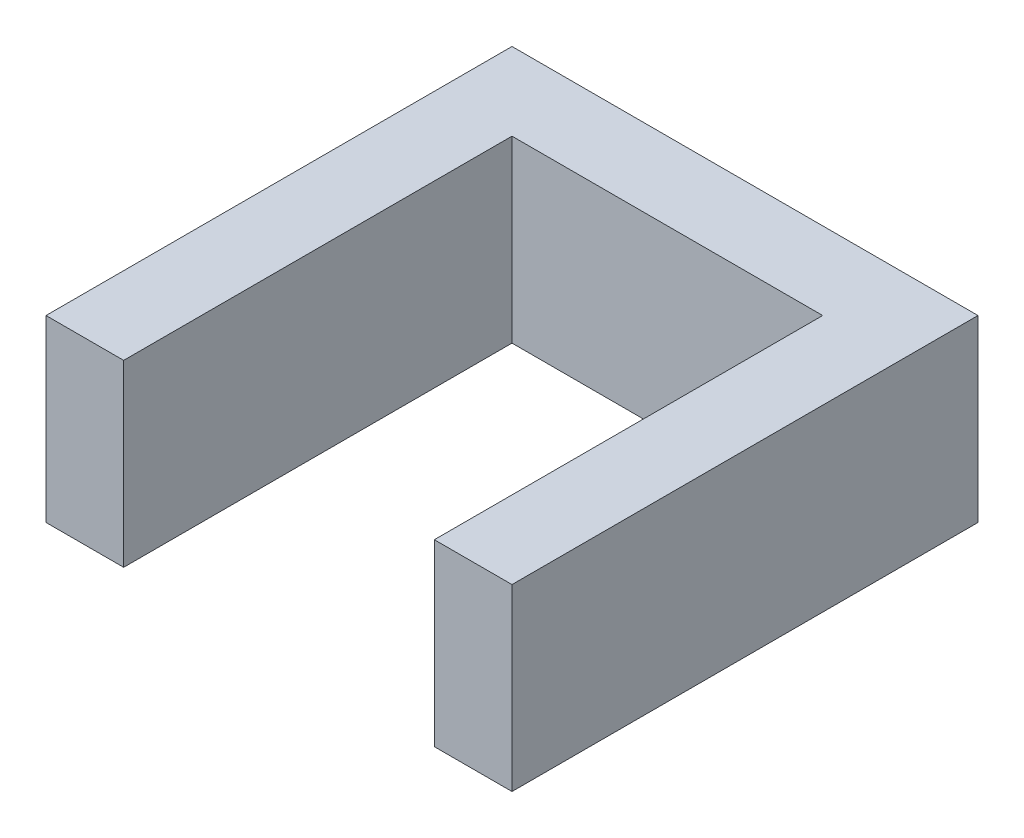
ISO-10303-21;
HEADER;
FILE_DESCRIPTION(('STEP AP214'),'2;1');
FILE_NAME('part.step','',(''),(''),'','','');
FILE_SCHEMA(('AUTOMOTIVE_DESIGN { 1 0 10303 214 1 1 1 1 }'));
ENDSEC;
DATA;
#1=APPLICATION_CONTEXT('core data for automotive mechanical design processes');
#2=APPLICATION_PROTOCOL_DEFINITION('international standard','automotive_design',2000,#1);
#3=PRODUCT_CONTEXT('',#1,'mechanical');
#4=PRODUCT('Part','Part','',(#3));
#5=PRODUCT_RELATED_PRODUCT_CATEGORY('part','',(#4));
#6=PRODUCT_DEFINITION_FORMATION('','',#4);
#7=PRODUCT_DEFINITION_CONTEXT('part definition',#1,'design');
#8=PRODUCT_DEFINITION('design','',#6,#7);
#9=PRODUCT_DEFINITION_SHAPE('','',#8);
#10=(LENGTH_UNIT() NAMED_UNIT(*) SI_UNIT(.MILLI.,.METRE.));
#11=(NAMED_UNIT(*) PLANE_ANGLE_UNIT() SI_UNIT($,.RADIAN.));
#12=(NAMED_UNIT(*) SI_UNIT($,.STERADIAN.) SOLID_ANGLE_UNIT());
#13=UNCERTAINTY_MEASURE_WITH_UNIT(LENGTH_MEASURE(1.E-05),#10,'distance_accuracy_value','');
#14=(GEOMETRIC_REPRESENTATION_CONTEXT(3) GLOBAL_UNCERTAINTY_ASSIGNED_CONTEXT((#13)) GLOBAL_UNIT_ASSIGNED_CONTEXT((#10,
#11,#12)) REPRESENTATION_CONTEXT('',''));
#15=CARTESIAN_POINT('',(0.,0.,0.));
#16=DIRECTION('',(0.,0.,1.));
#17=DIRECTION('',(1.,0.,0.));
#18=AXIS2_PLACEMENT_3D('',#15,#16,#17);
#19=CARTESIAN_POINT('',(5.,11.54,0.));
#20=DIRECTION('',(0.,0.,-1.));
#21=DIRECTION('',(-1.,0.,0.));
#22=AXIS2_PLACEMENT_3D('',#19,#20,#21);
#23=PLANE('',#22);
#24=DIRECTION('',(1.,0.,0.));
#25=VECTOR('',#24,1.);
#26=CARTESIAN_POINT('',(5.,0.,0.));
#27=LINE('',#26,#25);
#28=CARTESIAN_POINT('',(0.,0.,0.));
#29=VERTEX_POINT('',#28);
#30=CARTESIAN_POINT('',(5.,0.,0.));
#31=VERTEX_POINT('',#30);
#32=EDGE_CURVE('E140',#29,#31,#27,.T.);
#33=ORIENTED_EDGE('',*,*,#32,.T.);
#34=DIRECTION('',(0.,-1.,0.));
#35=VECTOR('',#34,1.);
#36=CARTESIAN_POINT('',(5.,11.54,0.));
#37=LINE('',#36,#35);
#38=CARTESIAN_POINT('',(5.,11.54,0.));
#39=VERTEX_POINT('',#38);
#40=EDGE_CURVE('E11',#39,#31,#37,.T.);
#41=ORIENTED_EDGE('',*,*,#40,.F.);
#42=DIRECTION('',(1.,0.,0.));
#43=VECTOR('',#42,1.);
#44=CARTESIAN_POINT('',(5.,11.54,0.));
#45=LINE('',#44,#43);
#46=CARTESIAN_POINT('',(0.,11.54,0.));
#47=VERTEX_POINT('',#46);
#48=EDGE_CURVE('E162',#47,#39,#45,.T.);
#49=ORIENTED_EDGE('',*,*,#48,.F.);
#50=DIRECTION('',(0.,-1.,0.));
#51=VECTOR('',#50,1.);
#52=CARTESIAN_POINT('',(0.,11.54,0.));
#53=LINE('',#52,#51);
#54=EDGE_CURVE('E136',#47,#29,#53,.T.);
#55=ORIENTED_EDGE('',*,*,#54,.T.);
#56=EDGE_LOOP('',(#33,#41,#49,#55));
#57=FACE_BOUND('',#56,.T.);
#58=ADVANCED_FACE('F39',(#57),#23,.F.);
#59=CARTESIAN_POINT('',(5.,11.54,0.));
#60=DIRECTION('',(-1.,0.,0.));
#61=DIRECTION('',(0.,0.,1.));
#62=AXIS2_PLACEMENT_3D('',#59,#60,#61);
#63=PLANE('',#62);
#64=DIRECTION('',(0.,0.,-1.));
#65=VECTOR('',#64,1.);
#66=CARTESIAN_POINT('',(5.,0.,0.));
#67=LINE('',#66,#65);
#68=CARTESIAN_POINT('',(5.,0.,-25.));
#69=VERTEX_POINT('',#68);
#70=EDGE_CURVE('E144',#31,#69,#67,.T.);
#71=ORIENTED_EDGE('',*,*,#70,.T.);
#72=DIRECTION('',(0.,-1.,0.));
#73=VECTOR('',#72,1.);
#74=CARTESIAN_POINT('',(5.,11.54,-25.));
#75=LINE('',#74,#73);
#76=CARTESIAN_POINT('',(5.,11.54,-25.));
#77=VERTEX_POINT('',#76);
#78=EDGE_CURVE('E48',#77,#69,#75,.T.);
#79=ORIENTED_EDGE('',*,*,#78,.F.);
#80=DIRECTION('',(0.,0.,-1.));
#81=VECTOR('',#80,1.);
#82=CARTESIAN_POINT('',(5.,11.54,0.));
#83=LINE('',#82,#81);
#84=EDGE_CURVE('E99',#39,#77,#83,.T.);
#85=ORIENTED_EDGE('',*,*,#84,.F.);
#86=ORIENTED_EDGE('',*,*,#40,.T.);
#87=EDGE_LOOP('',(#71,#79,#85,#86));
#88=FACE_BOUND('',#87,.T.);
#89=ADVANCED_FACE('F208',(#88),#63,.F.);
#90=CARTESIAN_POINT('',(5.,11.54,-25.));
#91=DIRECTION('',(0.,0.,-1.));
#92=DIRECTION('',(-1.,0.,0.));
#93=AXIS2_PLACEMENT_3D('',#90,#91,#92);
#94=PLANE('',#93);
#95=DIRECTION('',(1.,0.,0.));
#96=VECTOR('',#95,1.);
#97=CARTESIAN_POINT('',(5.,0.,-25.));
#98=LINE('',#97,#96);
#99=CARTESIAN_POINT('',(25.,0.,-25.));
#100=VERTEX_POINT('',#99);
#101=EDGE_CURVE('E147',#69,#100,#98,.T.);
#102=ORIENTED_EDGE('',*,*,#101,.T.);
#103=DIRECTION('',(0.,-1.,0.));
#104=VECTOR('',#103,1.);
#105=CARTESIAN_POINT('',(25.,11.54,-25.));
#106=LINE('',#105,#104);
#107=CARTESIAN_POINT('',(25.,11.54,-25.));
#108=VERTEX_POINT('',#107);
#109=EDGE_CURVE('E173',#108,#100,#106,.T.);
#110=ORIENTED_EDGE('',*,*,#109,.F.);
#111=DIRECTION('',(1.,0.,0.));
#112=VECTOR('',#111,1.);
#113=CARTESIAN_POINT('',(5.,11.54,-25.));
#114=LINE('',#113,#112);
#115=EDGE_CURVE('E183',#77,#108,#114,.T.);
#116=ORIENTED_EDGE('',*,*,#115,.F.);
#117=ORIENTED_EDGE('',*,*,#78,.T.);
#118=EDGE_LOOP('',(#102,#110,#116,#117));
#119=FACE_BOUND('',#118,.T.);
#120=ADVANCED_FACE('F181',(#119),#94,.F.);
#121=CARTESIAN_POINT('',(25.,11.54,-25.));
#122=DIRECTION('',(1.,0.,0.));
#123=DIRECTION('',(0.,0.,-1.));
#124=AXIS2_PLACEMENT_3D('',#121,#122,#123);
#125=PLANE('',#124);
#126=DIRECTION('',(0.,0.,1.));
#127=VECTOR('',#126,1.);
#128=CARTESIAN_POINT('',(25.,0.,-25.));
#129=LINE('',#128,#127);
#130=CARTESIAN_POINT('',(25.,0.,0.));
#131=VERTEX_POINT('',#130);
#132=EDGE_CURVE('E150',#100,#131,#129,.T.);
#133=ORIENTED_EDGE('',*,*,#132,.T.);
#134=DIRECTION('',(0.,-1.,0.));
#135=VECTOR('',#134,1.);
#136=CARTESIAN_POINT('',(25.,11.54,0.));
#137=LINE('',#136,#135);
#138=CARTESIAN_POINT('',(25.,11.54,0.));
#139=VERTEX_POINT('',#138);
#140=EDGE_CURVE('E169',#139,#131,#137,.T.);
#141=ORIENTED_EDGE('',*,*,#140,.F.);
#142=DIRECTION('',(0.,0.,1.));
#143=VECTOR('',#142,1.);
#144=CARTESIAN_POINT('',(25.,11.54,-25.));
#145=LINE('',#144,#143);
#146=EDGE_CURVE('E196',#108,#139,#145,.T.);
#147=ORIENTED_EDGE('',*,*,#146,.F.);
#148=ORIENTED_EDGE('',*,*,#109,.T.);
#149=EDGE_LOOP('',(#133,#141,#147,#148));
#150=FACE_BOUND('',#149,.T.);
#151=ADVANCED_FACE('F191',(#150),#125,.F.);
#152=CARTESIAN_POINT('',(30.,11.54,0.));
#153=DIRECTION('',(0.,0.,-1.));
#154=DIRECTION('',(-1.,0.,0.));
#155=AXIS2_PLACEMENT_3D('',#152,#153,#154);
#156=PLANE('',#155);
#157=DIRECTION('',(1.,0.,0.));
#158=VECTOR('',#157,1.);
#159=CARTESIAN_POINT('',(30.,0.,0.));
#160=LINE('',#159,#158);
#161=CARTESIAN_POINT('',(30.,0.,0.));
#162=VERTEX_POINT('',#161);
#163=EDGE_CURVE('E153',#131,#162,#160,.T.);
#164=ORIENTED_EDGE('',*,*,#163,.T.);
#165=DIRECTION('',(0.,-1.,0.));
#166=VECTOR('',#165,1.);
#167=CARTESIAN_POINT('',(30.,11.54,0.));
#168=LINE('',#167,#166);
#169=CARTESIAN_POINT('',(30.,11.54,0.));
#170=VERTEX_POINT('',#169);
#171=EDGE_CURVE('E129',#170,#162,#168,.T.);
#172=ORIENTED_EDGE('',*,*,#171,.F.);
#173=DIRECTION('',(1.,0.,0.));
#174=VECTOR('',#173,1.);
#175=CARTESIAN_POINT('',(30.,11.54,0.));
#176=LINE('',#175,#174);
#177=EDGE_CURVE('E118',#139,#170,#176,.T.);
#178=ORIENTED_EDGE('',*,*,#177,.F.);
#179=ORIENTED_EDGE('',*,*,#140,.T.);
#180=EDGE_LOOP('',(#164,#172,#178,#179));
#181=FACE_BOUND('',#180,.T.);
#182=ADVANCED_FACE('F194',(#181),#156,.F.);
#183=CARTESIAN_POINT('',(30.,11.54,-30.));
#184=DIRECTION('',(-1.,0.,0.));
#185=DIRECTION('',(0.,0.,1.));
#186=AXIS2_PLACEMENT_3D('',#183,#184,#185);
#187=PLANE('',#186);
#188=DIRECTION('',(0.,0.,-1.));
#189=VECTOR('',#188,1.);
#190=CARTESIAN_POINT('',(30.,0.,-30.));
#191=LINE('',#190,#189);
#192=CARTESIAN_POINT('',(30.,0.,-30.));
#193=VERTEX_POINT('',#192);
#194=EDGE_CURVE('E127',#162,#193,#191,.T.);
#195=ORIENTED_EDGE('',*,*,#194,.T.);
#196=DIRECTION('',(0.,-1.,0.));
#197=VECTOR('',#196,1.);
#198=CARTESIAN_POINT('',(30.,11.54,-30.));
#199=LINE('',#198,#197);
#200=CARTESIAN_POINT('',(30.,11.54,-30.));
#201=VERTEX_POINT('',#200);
#202=EDGE_CURVE('E124',#201,#193,#199,.T.);
#203=ORIENTED_EDGE('',*,*,#202,.F.);
#204=DIRECTION('',(0.,0.,-1.));
#205=VECTOR('',#204,1.);
#206=CARTESIAN_POINT('',(30.,11.54,-30.));
#207=LINE('',#206,#205);
#208=EDGE_CURVE('E112',#170,#201,#207,.T.);
#209=ORIENTED_EDGE('',*,*,#208,.F.);
#210=ORIENTED_EDGE('',*,*,#171,.T.);
#211=EDGE_LOOP('',(#195,#203,#209,#210));
#212=FACE_BOUND('',#211,.T.);
#213=ADVANCED_FACE('F125',(#212),#187,.F.);
#214=CARTESIAN_POINT('',(0.,11.54,-30.));
#215=DIRECTION('',(0.,0.,1.));
#216=DIRECTION('',(1.,0.,0.));
#217=AXIS2_PLACEMENT_3D('',#214,#215,#216);
#218=PLANE('',#217);
#219=DIRECTION('',(-1.,0.,0.));
#220=VECTOR('',#219,1.);
#221=CARTESIAN_POINT('',(0.,0.,-30.));
#222=LINE('',#221,#220);
#223=CARTESIAN_POINT('',(0.,0.,-30.));
#224=VERTEX_POINT('',#223);
#225=EDGE_CURVE('E85',#193,#224,#222,.T.);
#226=ORIENTED_EDGE('',*,*,#225,.T.);
#227=DIRECTION('',(0.,-1.,0.));
#228=VECTOR('',#227,1.);
#229=CARTESIAN_POINT('',(0.,11.54,-30.));
#230=LINE('',#229,#228);
#231=CARTESIAN_POINT('',(0.,11.54,-30.));
#232=VERTEX_POINT('',#231);
#233=EDGE_CURVE('E130',#232,#224,#230,.T.);
#234=ORIENTED_EDGE('',*,*,#233,.F.);
#235=DIRECTION('',(-1.,0.,0.));
#236=VECTOR('',#235,1.);
#237=CARTESIAN_POINT('',(0.,11.54,-30.));
#238=LINE('',#237,#236);
#239=EDGE_CURVE('E116',#201,#232,#238,.T.);
#240=ORIENTED_EDGE('',*,*,#239,.F.);
#241=ORIENTED_EDGE('',*,*,#202,.T.);
#242=EDGE_LOOP('',(#226,#234,#240,#241));
#243=FACE_BOUND('',#242,.T.);
#244=ADVANCED_FACE('F132',(#243),#218,.F.);
#245=CARTESIAN_POINT('',(0.,11.54,0.));
#246=DIRECTION('',(1.,0.,0.));
#247=DIRECTION('',(0.,0.,-1.));
#248=AXIS2_PLACEMENT_3D('',#245,#246,#247);
#249=PLANE('',#248);
#250=DIRECTION('',(0.,0.,1.));
#251=VECTOR('',#250,1.);
#252=CARTESIAN_POINT('',(0.,0.,0.));
#253=LINE('',#252,#251);
#254=EDGE_CURVE('E91',#224,#29,#253,.T.);
#255=ORIENTED_EDGE('',*,*,#254,.T.);
#256=ORIENTED_EDGE('',*,*,#54,.F.);
#257=DIRECTION('',(0.,0.,1.));
#258=VECTOR('',#257,1.);
#259=CARTESIAN_POINT('',(0.,11.54,0.));
#260=LINE('',#259,#258);
#261=EDGE_CURVE('E56',#232,#47,#260,.T.);
#262=ORIENTED_EDGE('',*,*,#261,.F.);
#263=ORIENTED_EDGE('',*,*,#233,.T.);
#264=EDGE_LOOP('',(#255,#256,#262,#263));
#265=FACE_BOUND('',#264,.T.);
#266=ADVANCED_FACE('F224',(#265),#249,.F.);
#267=CARTESIAN_POINT('',(0.,11.54,0.));
#268=DIRECTION('',(0.,-1.,0.));
#269=DIRECTION('',(0.,0.,-1.));
#270=AXIS2_PLACEMENT_3D('',#267,#268,#269);
#271=PLANE('',#270);
#272=ORIENTED_EDGE('',*,*,#48,.T.);
#273=ORIENTED_EDGE('',*,*,#84,.T.);
#274=ORIENTED_EDGE('',*,*,#115,.T.);
#275=ORIENTED_EDGE('',*,*,#146,.T.);
#276=ORIENTED_EDGE('',*,*,#177,.T.);
#277=ORIENTED_EDGE('',*,*,#208,.T.);
#278=ORIENTED_EDGE('',*,*,#239,.T.);
#279=ORIENTED_EDGE('',*,*,#261,.T.);
#280=EDGE_LOOP('',(#272,#273,#274,#275,#276,#277,#278,#279));
#281=FACE_BOUND('',#280,.T.);
#282=ADVANCED_FACE('F114',(#281),#271,.F.);
#283=CARTESIAN_POINT('',(0.,0.,0.));
#284=DIRECTION('',(0.,-1.,0.));
#285=DIRECTION('',(0.,0.,-1.));
#286=AXIS2_PLACEMENT_3D('',#283,#284,#285);
#287=PLANE('',#286);
#288=ORIENTED_EDGE('',*,*,#32,.F.);
#289=ORIENTED_EDGE('',*,*,#254,.F.);
#290=ORIENTED_EDGE('',*,*,#225,.F.);
#291=ORIENTED_EDGE('',*,*,#194,.F.);
#292=ORIENTED_EDGE('',*,*,#163,.F.);
#293=ORIENTED_EDGE('',*,*,#132,.F.);
#294=ORIENTED_EDGE('',*,*,#101,.F.);
#295=ORIENTED_EDGE('',*,*,#70,.F.);
#296=EDGE_LOOP('',(#288,#289,#290,#291,#292,#293,#294,#295));
#297=FACE_BOUND('',#296,.T.);
#298=ADVANCED_FACE('F187',(#297),#287,.T.);
#299=CLOSED_SHELL('',(#58,#89,#120,#151,#182,#213,#244,#266,#282,#298));
#300=MANIFOLD_SOLID_BREP('B2',#299);
#301=ADVANCED_BREP_SHAPE_REPRESENTATION('',(#18,#300),#14);
#302=SHAPE_DEFINITION_REPRESENTATION(#9,#301);
ENDSEC;
END-ISO-10303-21;
